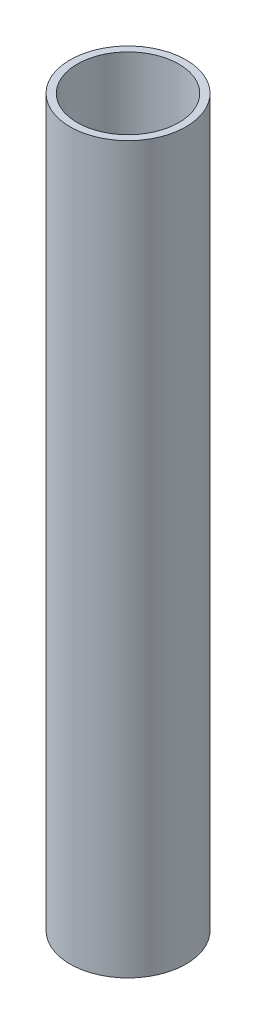
ISO-10303-21;
HEADER;
FILE_DESCRIPTION(('STEP AP214'),'2;1');
FILE_NAME('part.step','',(''),(''),'','','');
FILE_SCHEMA(('AUTOMOTIVE_DESIGN { 1 0 10303 214 1 1 1 1 }'));
ENDSEC;
DATA;
#1=APPLICATION_CONTEXT('core data for automotive mechanical design processes');
#2=APPLICATION_PROTOCOL_DEFINITION('international standard','automotive_design',2000,#1);
#3=PRODUCT_CONTEXT('',#1,'mechanical');
#4=PRODUCT('Part','Part','',(#3));
#5=PRODUCT_RELATED_PRODUCT_CATEGORY('part','',(#4));
#6=PRODUCT_DEFINITION_FORMATION('','',#4);
#7=PRODUCT_DEFINITION_CONTEXT('part definition',#1,'design');
#8=PRODUCT_DEFINITION('design','',#6,#7);
#9=PRODUCT_DEFINITION_SHAPE('','',#8);
#10=(LENGTH_UNIT() NAMED_UNIT(*) SI_UNIT(.MILLI.,.METRE.));
#11=(NAMED_UNIT(*) PLANE_ANGLE_UNIT() SI_UNIT($,.RADIAN.));
#12=(NAMED_UNIT(*) SI_UNIT($,.STERADIAN.) SOLID_ANGLE_UNIT());
#13=UNCERTAINTY_MEASURE_WITH_UNIT(LENGTH_MEASURE(1.E-05),#10,'distance_accuracy_value','');
#14=(GEOMETRIC_REPRESENTATION_CONTEXT(3) GLOBAL_UNCERTAINTY_ASSIGNED_CONTEXT((#13)) GLOBAL_UNIT_ASSIGNED_CONTEXT((#10,
#11,#12)) REPRESENTATION_CONTEXT('',''));
#15=CARTESIAN_POINT('',(0.,0.,0.));
#16=DIRECTION('',(0.,0.,1.));
#17=DIRECTION('',(1.,0.,0.));
#18=AXIS2_PLACEMENT_3D('',#15,#16,#17);
#19=CARTESIAN_POINT('',(27.5924738164473,-117.770243558021,175.673262417269));
#20=DIRECTION('',(0.,-1.,0.));
#21=DIRECTION('',(0.,0.,-1.));
#22=AXIS2_PLACEMENT_3D('',#19,#20,#21);
#23=PLANE('',#22);
#24=CARTESIAN_POINT('',(27.5924738164473,-117.770243558021,175.673262417269));
#25=DIRECTION('',(0.,-1.,0.));
#26=DIRECTION('',(0.,0.,-1.));
#27=AXIS2_PLACEMENT_3D('',#24,#25,#26);
#28=CIRCLE('',#27,7.99998849659121);
#29=CARTESIAN_POINT('',(27.5924738164473,-117.770243558021,167.673273920678));
#30=VERTEX_POINT('',#29);
#31=EDGE_CURVE('E10',#30,#30,#28,.T.);
#32=ORIENTED_EDGE('',*,*,#31,.T.);
#33=EDGE_LOOP('',(#32));
#34=FACE_BOUND('',#33,.T.);
#35=CARTESIAN_POINT('',(27.5924738164473,-117.770243558021,175.673262417269));
#36=DIRECTION('',(0.,-1.,0.));
#37=DIRECTION('',(0.,0.,-1.));
#38=AXIS2_PLACEMENT_3D('',#35,#36,#37);
#39=CIRCLE('',#38,7.00000000000001);
#40=CARTESIAN_POINT('',(27.5924738164473,-117.770243558021,168.673262417269));
#41=VERTEX_POINT('',#40);
#42=EDGE_CURVE('E40',#41,#41,#39,.T.);
#43=ORIENTED_EDGE('',*,*,#42,.F.);
#44=EDGE_LOOP('',(#43));
#45=FACE_BOUND('',#44,.T.);
#46=ADVANCED_FACE('F29',(#34,#45),#23,.T.);
#47=CARTESIAN_POINT('',(27.5924738164473,-17.7702435580206,175.673262417269));
#48=DIRECTION('',(0.,-1.,0.));
#49=DIRECTION('',(0.,0.,-1.));
#50=AXIS2_PLACEMENT_3D('',#47,#48,#49);
#51=PLANE('',#50);
#52=CARTESIAN_POINT('',(27.5924738164473,-17.7702435580206,175.673262417269));
#53=DIRECTION('',(0.,-1.,0.));
#54=DIRECTION('',(0.,0.,-1.));
#55=AXIS2_PLACEMENT_3D('',#52,#53,#54);
#56=CIRCLE('',#55,7.99998849659121);
#57=CARTESIAN_POINT('',(27.5924738164473,-17.7702435580206,167.673273920678));
#58=VERTEX_POINT('',#57);
#59=EDGE_CURVE('E33',#58,#58,#56,.T.);
#60=ORIENTED_EDGE('',*,*,#59,.F.);
#61=EDGE_LOOP('',(#60));
#62=FACE_BOUND('',#61,.T.);
#63=CARTESIAN_POINT('',(27.5924738164473,-17.7702435580206,175.673262417269));
#64=DIRECTION('',(0.,-1.,0.));
#65=DIRECTION('',(0.,0.,-1.));
#66=AXIS2_PLACEMENT_3D('',#63,#64,#65);
#67=CIRCLE('',#66,7.00000000000001);
#68=CARTESIAN_POINT('',(27.5924738164473,-17.7702435580206,168.673262417269));
#69=VERTEX_POINT('',#68);
#70=EDGE_CURVE('E42',#69,#69,#67,.T.);
#71=ORIENTED_EDGE('',*,*,#70,.T.);
#72=EDGE_LOOP('',(#71));
#73=FACE_BOUND('',#72,.T.);
#74=ADVANCED_FACE('F52',(#62,#73),#51,.F.);
#75=CARTESIAN_POINT('',(27.5924738164473,-117.770243558021,175.673262417269));
#76=DIRECTION('',(0.,1.,0.));
#77=DIRECTION('',(0.,0.,1.));
#78=AXIS2_PLACEMENT_3D('',#75,#76,#77);
#79=CYLINDRICAL_SURFACE('',#78,7.99998849659121);
#80=ORIENTED_EDGE('',*,*,#31,.F.);
#81=EDGE_LOOP('',(#80));
#82=FACE_BOUND('',#81,.T.);
#83=ORIENTED_EDGE('',*,*,#59,.T.);
#84=EDGE_LOOP('',(#83));
#85=FACE_BOUND('',#84,.T.);
#86=ADVANCED_FACE('F31',(#82,#85),#79,.T.);
#87=CARTESIAN_POINT('',(27.5924738164473,-117.770243558021,175.673262417269));
#88=DIRECTION('',(0.,1.,0.));
#89=DIRECTION('',(0.,0.,1.));
#90=AXIS2_PLACEMENT_3D('',#87,#88,#89);
#91=CYLINDRICAL_SURFACE('',#90,7.00000000000001);
#92=ORIENTED_EDGE('',*,*,#42,.T.);
#93=EDGE_LOOP('',(#92));
#94=FACE_BOUND('',#93,.T.);
#95=ORIENTED_EDGE('',*,*,#70,.F.);
#96=EDGE_LOOP('',(#95));
#97=FACE_BOUND('',#96,.T.);
#98=ADVANCED_FACE('F48',(#94,#97),#91,.F.);
#99=CLOSED_SHELL('',(#46,#74,#86,#98));
#100=MANIFOLD_SOLID_BREP('B2',#99);
#101=ADVANCED_BREP_SHAPE_REPRESENTATION('',(#18,#100),#14);
#102=SHAPE_DEFINITION_REPRESENTATION(#9,#101);
ENDSEC;
END-ISO-10303-21;
